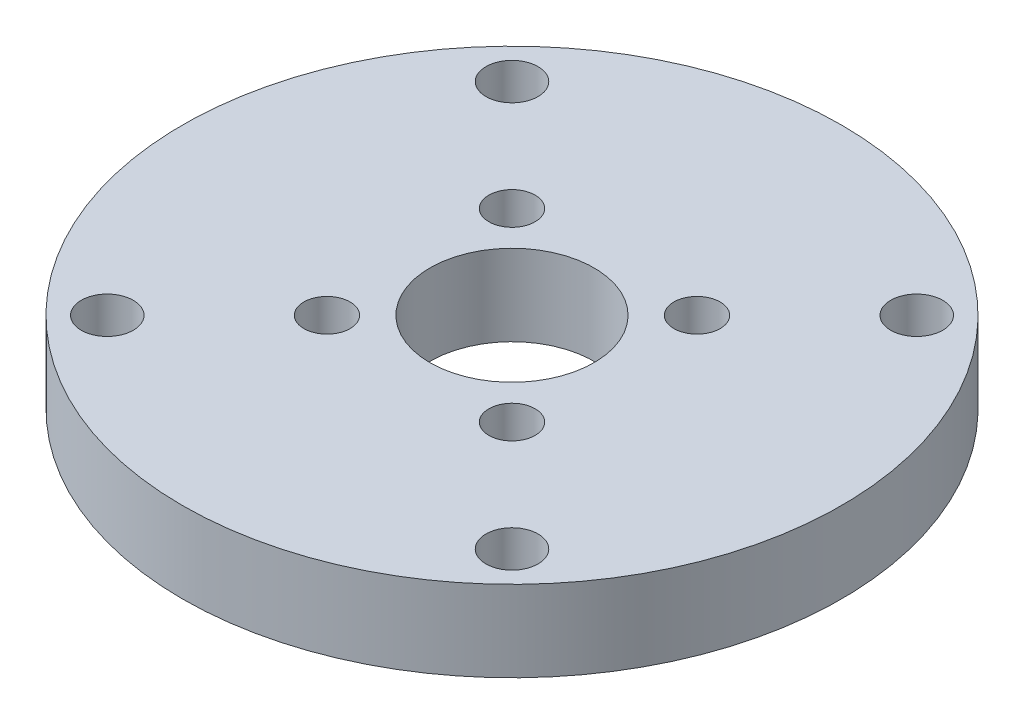
ISO-10303-21;
HEADER;
FILE_DESCRIPTION(('STEP AP214'),'2;1');
FILE_NAME('part.step','',(''),(''),'','','');
FILE_SCHEMA(('AUTOMOTIVE_DESIGN { 1 0 10303 214 1 1 1 1 }'));
ENDSEC;
DATA;
#1=APPLICATION_CONTEXT('core data for automotive mechanical design processes');
#2=APPLICATION_PROTOCOL_DEFINITION('international standard','automotive_design',2000,#1);
#3=PRODUCT_CONTEXT('',#1,'mechanical');
#4=PRODUCT('Part','Part','',(#3));
#5=PRODUCT_RELATED_PRODUCT_CATEGORY('part','',(#4));
#6=PRODUCT_DEFINITION_FORMATION('','',#4);
#7=PRODUCT_DEFINITION_CONTEXT('part definition',#1,'design');
#8=PRODUCT_DEFINITION('design','',#6,#7);
#9=PRODUCT_DEFINITION_SHAPE('','',#8);
#10=(LENGTH_UNIT() NAMED_UNIT(*) SI_UNIT(.MILLI.,.METRE.));
#11=(NAMED_UNIT(*) PLANE_ANGLE_UNIT() SI_UNIT($,.RADIAN.));
#12=(NAMED_UNIT(*) SI_UNIT($,.STERADIAN.) SOLID_ANGLE_UNIT());
#13=UNCERTAINTY_MEASURE_WITH_UNIT(LENGTH_MEASURE(1.E-05),#10,'distance_accuracy_value','');
#14=(GEOMETRIC_REPRESENTATION_CONTEXT(3) GLOBAL_UNCERTAINTY_ASSIGNED_CONTEXT((#13)) GLOBAL_UNIT_ASSIGNED_CONTEXT((#10,
#11,#12)) REPRESENTATION_CONTEXT('',''));
#15=CARTESIAN_POINT('',(0.,0.,0.));
#16=DIRECTION('',(0.,0.,1.));
#17=DIRECTION('',(1.,0.,0.));
#18=AXIS2_PLACEMENT_3D('',#15,#16,#17);
#19=CARTESIAN_POINT('',(0.,3.5,0.));
#20=DIRECTION('',(0.,-1.,0.));
#21=DIRECTION('',(0.,0.,-1.));
#22=AXIS2_PLACEMENT_3D('',#19,#20,#21);
#23=CYLINDRICAL_SURFACE('',#22,28.5);
#24=CARTESIAN_POINT('',(0.,3.5,0.));
#25=DIRECTION('',(0.,1.,0.));
#26=DIRECTION('',(0.,0.,1.));
#27=AXIS2_PLACEMENT_3D('',#24,#25,#26);
#28=CIRCLE('',#27,28.5);
#29=CARTESIAN_POINT('',(0.,3.5,28.5));
#30=VERTEX_POINT('',#29);
#31=EDGE_CURVE('E10',#30,#30,#28,.T.);
#32=ORIENTED_EDGE('',*,*,#31,.F.);
#33=EDGE_LOOP('',(#32));
#34=FACE_BOUND('',#33,.T.);
#35=CARTESIAN_POINT('',(0.,-3.5,0.));
#36=DIRECTION('',(0.,1.,0.));
#37=DIRECTION('',(0.,0.,1.));
#38=AXIS2_PLACEMENT_3D('',#35,#36,#37);
#39=CIRCLE('',#38,28.5);
#40=CARTESIAN_POINT('',(0.,-3.5,28.5));
#41=VERTEX_POINT('',#40);
#42=EDGE_CURVE('E40',#41,#41,#39,.T.);
#43=ORIENTED_EDGE('',*,*,#42,.T.);
#44=EDGE_LOOP('',(#43));
#45=FACE_BOUND('',#44,.T.);
#46=ADVANCED_FACE('F37',(#34,#45),#23,.T.);
#47=CARTESIAN_POINT('',(0.,3.5,0.));
#48=DIRECTION('',(0.,1.,0.));
#49=DIRECTION('',(0.,0.,1.));
#50=AXIS2_PLACEMENT_3D('',#47,#48,#49);
#51=PLANE('',#50);
#52=CARTESIAN_POINT('',(0.,3.5,0.));
#53=DIRECTION('',(0.,1.,0.));
#54=DIRECTION('',(0.,0.,1.));
#55=AXIS2_PLACEMENT_3D('',#52,#53,#54);
#56=CIRCLE('',#55,7.1);
#57=CARTESIAN_POINT('',(0.,3.5,7.1));
#58=VERTEX_POINT('',#57);
#59=EDGE_CURVE('E97',#58,#58,#56,.T.);
#60=ORIENTED_EDGE('',*,*,#59,.F.);
#61=EDGE_LOOP('',(#60));
#62=FACE_BOUND('',#61,.T.);
#63=CARTESIAN_POINT('',(17.5008928343671,3.5,17.500892834367));
#64=DIRECTION('',(0.,1.,0.));
#65=DIRECTION('',(0.,0.,1.));
#66=AXIS2_PLACEMENT_3D('',#63,#64,#65);
#67=CIRCLE('',#66,2.25);
#68=CARTESIAN_POINT('',(17.5008928343671,3.5,19.750892834367));
#69=VERTEX_POINT('',#68);
#70=EDGE_CURVE('E52',#69,#69,#67,.T.);
#71=ORIENTED_EDGE('',*,*,#70,.F.);
#72=EDGE_LOOP('',(#71));
#73=FACE_BOUND('',#72,.T.);
#74=CARTESIAN_POINT('',(-17.500892834367,3.5,17.5008928343671));
#75=DIRECTION('',(0.,1.,0.));
#76=DIRECTION('',(0.,0.,1.));
#77=AXIS2_PLACEMENT_3D('',#74,#75,#76);
#78=CIRCLE('',#77,2.25);
#79=CARTESIAN_POINT('',(-17.500892834367,3.5,19.7508928343671));
#80=VERTEX_POINT('',#79);
#81=EDGE_CURVE('E71',#80,#80,#78,.T.);
#82=ORIENTED_EDGE('',*,*,#81,.F.);
#83=EDGE_LOOP('',(#82));
#84=FACE_BOUND('',#83,.T.);
#85=CARTESIAN_POINT('',(-17.5008928343671,3.5,-17.500892834367));
#86=DIRECTION('',(0.,1.,0.));
#87=DIRECTION('',(0.,0.,1.));
#88=AXIS2_PLACEMENT_3D('',#85,#86,#87);
#89=CIRCLE('',#88,2.25);
#90=CARTESIAN_POINT('',(-17.5008928343671,3.5,-15.250892834367));
#91=VERTEX_POINT('',#90);
#92=EDGE_CURVE('E65',#91,#91,#89,.T.);
#93=ORIENTED_EDGE('',*,*,#92,.F.);
#94=EDGE_LOOP('',(#93));
#95=FACE_BOUND('',#94,.T.);
#96=CARTESIAN_POINT('',(-8.,3.5,8.));
#97=DIRECTION('',(0.,1.,0.));
#98=DIRECTION('',(0.,0.,1.));
#99=AXIS2_PLACEMENT_3D('',#96,#97,#98);
#100=CIRCLE('',#99,2.);
#101=CARTESIAN_POINT('',(-8.,3.5,10.));
#102=VERTEX_POINT('',#101);
#103=EDGE_CURVE('E58',#102,#102,#100,.T.);
#104=ORIENTED_EDGE('',*,*,#103,.F.);
#105=EDGE_LOOP('',(#104));
#106=FACE_BOUND('',#105,.T.);
#107=CARTESIAN_POINT('',(-8.,3.5,-8.));
#108=DIRECTION('',(0.,1.,0.));
#109=DIRECTION('',(0.,0.,1.));
#110=AXIS2_PLACEMENT_3D('',#107,#108,#109);
#111=CIRCLE('',#110,2.);
#112=CARTESIAN_POINT('',(-8.,3.5,-6.));
#113=VERTEX_POINT('',#112);
#114=EDGE_CURVE('E59',#113,#113,#111,.T.);
#115=ORIENTED_EDGE('',*,*,#114,.F.);
#116=EDGE_LOOP('',(#115));
#117=FACE_BOUND('',#116,.T.);
#118=CARTESIAN_POINT('',(8.,3.5,-8.));
#119=DIRECTION('',(0.,1.,0.));
#120=DIRECTION('',(0.,0.,1.));
#121=AXIS2_PLACEMENT_3D('',#118,#119,#120);
#122=CIRCLE('',#121,2.);
#123=CARTESIAN_POINT('',(8.,3.5,-6.));
#124=VERTEX_POINT('',#123);
#125=EDGE_CURVE('E89',#124,#124,#122,.T.);
#126=ORIENTED_EDGE('',*,*,#125,.F.);
#127=EDGE_LOOP('',(#126));
#128=FACE_BOUND('',#127,.T.);
#129=CARTESIAN_POINT('',(8.,3.5,8.));
#130=DIRECTION('',(0.,1.,0.));
#131=DIRECTION('',(0.,0.,1.));
#132=AXIS2_PLACEMENT_3D('',#129,#130,#131);
#133=CIRCLE('',#132,2.);
#134=CARTESIAN_POINT('',(8.,3.5,10.));
#135=VERTEX_POINT('',#134);
#136=EDGE_CURVE('E82',#135,#135,#133,.T.);
#137=ORIENTED_EDGE('',*,*,#136,.F.);
#138=EDGE_LOOP('',(#137));
#139=FACE_BOUND('',#138,.T.);
#140=CARTESIAN_POINT('',(17.500892834367,3.5,-17.5008928343671));
#141=DIRECTION('',(0.,1.,0.));
#142=DIRECTION('',(0.,0.,1.));
#143=AXIS2_PLACEMENT_3D('',#140,#141,#142);
#144=CIRCLE('',#143,2.25);
#145=CARTESIAN_POINT('',(17.500892834367,3.5,-15.2508928343671));
#146=VERTEX_POINT('',#145);
#147=EDGE_CURVE('E49',#146,#146,#144,.T.);
#148=ORIENTED_EDGE('',*,*,#147,.F.);
#149=EDGE_LOOP('',(#148));
#150=FACE_BOUND('',#149,.T.);
#151=ORIENTED_EDGE('',*,*,#31,.T.);
#152=EDGE_LOOP('',(#151));
#153=FACE_BOUND('',#152,.T.);
#154=ADVANCED_FACE('F113',(#62,#73,#84,#95,#106,#117,#128,#139,#150,#153),#51,.T.);
#155=CARTESIAN_POINT('',(0.,-3.5,0.));
#156=DIRECTION('',(0.,1.,0.));
#157=DIRECTION('',(0.,0.,1.));
#158=AXIS2_PLACEMENT_3D('',#155,#156,#157);
#159=PLANE('',#158);
#160=CARTESIAN_POINT('',(0.,-3.5,0.));
#161=DIRECTION('',(0.,1.,0.));
#162=DIRECTION('',(0.,0.,1.));
#163=AXIS2_PLACEMENT_3D('',#160,#161,#162);
#164=CIRCLE('',#163,7.1);
#165=CARTESIAN_POINT('',(0.,-3.5,7.1));
#166=VERTEX_POINT('',#165);
#167=EDGE_CURVE('E83',#166,#166,#164,.T.);
#168=ORIENTED_EDGE('',*,*,#167,.T.);
#169=EDGE_LOOP('',(#168));
#170=FACE_BOUND('',#169,.T.);
#171=CARTESIAN_POINT('',(17.5008928343671,-3.5,17.500892834367));
#172=DIRECTION('',(0.,1.,0.));
#173=DIRECTION('',(0.,0.,1.));
#174=AXIS2_PLACEMENT_3D('',#171,#172,#173);
#175=CIRCLE('',#174,2.25);
#176=CARTESIAN_POINT('',(17.5008928343671,-3.5,19.750892834367));
#177=VERTEX_POINT('',#176);
#178=EDGE_CURVE('E74',#177,#177,#175,.T.);
#179=ORIENTED_EDGE('',*,*,#178,.T.);
#180=EDGE_LOOP('',(#179));
#181=FACE_BOUND('',#180,.T.);
#182=CARTESIAN_POINT('',(-17.500892834367,-3.5,17.5008928343671));
#183=DIRECTION('',(0.,1.,0.));
#184=DIRECTION('',(0.,0.,1.));
#185=AXIS2_PLACEMENT_3D('',#182,#183,#184);
#186=CIRCLE('',#185,2.25);
#187=CARTESIAN_POINT('',(-17.500892834367,-3.5,19.7508928343671));
#188=VERTEX_POINT('',#187);
#189=EDGE_CURVE('E68',#188,#188,#186,.T.);
#190=ORIENTED_EDGE('',*,*,#189,.T.);
#191=EDGE_LOOP('',(#190));
#192=FACE_BOUND('',#191,.T.);
#193=CARTESIAN_POINT('',(-17.5008928343671,-3.5,-17.500892834367));
#194=DIRECTION('',(0.,1.,0.));
#195=DIRECTION('',(0.,0.,1.));
#196=AXIS2_PLACEMENT_3D('',#193,#194,#195);
#197=CIRCLE('',#196,2.25);
#198=CARTESIAN_POINT('',(-17.5008928343671,-3.5,-15.250892834367));
#199=VERTEX_POINT('',#198);
#200=EDGE_CURVE('E62',#199,#199,#197,.T.);
#201=ORIENTED_EDGE('',*,*,#200,.T.);
#202=EDGE_LOOP('',(#201));
#203=FACE_BOUND('',#202,.T.);
#204=CARTESIAN_POINT('',(-8.,-3.5,8.));
#205=DIRECTION('',(0.,1.,0.));
#206=DIRECTION('',(0.,0.,1.));
#207=AXIS2_PLACEMENT_3D('',#204,#205,#206);
#208=CIRCLE('',#207,2.);
#209=CARTESIAN_POINT('',(-8.,-3.5,10.));
#210=VERTEX_POINT('',#209);
#211=EDGE_CURVE('E55',#210,#210,#208,.T.);
#212=ORIENTED_EDGE('',*,*,#211,.T.);
#213=EDGE_LOOP('',(#212));
#214=FACE_BOUND('',#213,.T.);
#215=CARTESIAN_POINT('',(-8.,-3.5,-8.));
#216=DIRECTION('',(0.,1.,0.));
#217=DIRECTION('',(0.,0.,1.));
#218=AXIS2_PLACEMENT_3D('',#215,#216,#217);
#219=CIRCLE('',#218,2.);
#220=CARTESIAN_POINT('',(-8.,-3.5,-6.));
#221=VERTEX_POINT('',#220);
#222=EDGE_CURVE('E92',#221,#221,#219,.T.);
#223=ORIENTED_EDGE('',*,*,#222,.T.);
#224=EDGE_LOOP('',(#223));
#225=FACE_BOUND('',#224,.T.);
#226=CARTESIAN_POINT('',(8.,-3.5,-8.));
#227=DIRECTION('',(0.,1.,0.));
#228=DIRECTION('',(0.,0.,1.));
#229=AXIS2_PLACEMENT_3D('',#226,#227,#228);
#230=CIRCLE('',#229,2.);
#231=CARTESIAN_POINT('',(8.,-3.5,-6.));
#232=VERTEX_POINT('',#231);
#233=EDGE_CURVE('E86',#232,#232,#230,.T.);
#234=ORIENTED_EDGE('',*,*,#233,.T.);
#235=EDGE_LOOP('',(#234));
#236=FACE_BOUND('',#235,.T.);
#237=CARTESIAN_POINT('',(8.,-3.5,8.));
#238=DIRECTION('',(0.,1.,0.));
#239=DIRECTION('',(0.,0.,1.));
#240=AXIS2_PLACEMENT_3D('',#237,#238,#239);
#241=CIRCLE('',#240,2.);
#242=CARTESIAN_POINT('',(8.,-3.5,10.));
#243=VERTEX_POINT('',#242);
#244=EDGE_CURVE('E79',#243,#243,#241,.T.);
#245=ORIENTED_EDGE('',*,*,#244,.T.);
#246=EDGE_LOOP('',(#245));
#247=FACE_BOUND('',#246,.T.);
#248=CARTESIAN_POINT('',(17.500892834367,-3.5,-17.5008928343671));
#249=DIRECTION('',(0.,1.,0.));
#250=DIRECTION('',(0.,0.,1.));
#251=AXIS2_PLACEMENT_3D('',#248,#249,#250);
#252=CIRCLE('',#251,2.25);
#253=CARTESIAN_POINT('',(17.500892834367,-3.5,-15.2508928343671));
#254=VERTEX_POINT('',#253);
#255=EDGE_CURVE('E47',#254,#254,#252,.T.);
#256=ORIENTED_EDGE('',*,*,#255,.T.);
#257=EDGE_LOOP('',(#256));
#258=FACE_BOUND('',#257,.T.);
#259=ORIENTED_EDGE('',*,*,#42,.F.);
#260=EDGE_LOOP('',(#259));
#261=FACE_BOUND('',#260,.T.);
#262=ADVANCED_FACE('F103',(#170,#181,#192,#203,#214,#225,#236,#247,#258,#261),#159,.F.);
#263=CARTESIAN_POINT('',(17.500892834367,-3.5,-17.5008928343671));
#264=DIRECTION('',(0.,1.,0.));
#265=DIRECTION('',(0.,0.,1.));
#266=AXIS2_PLACEMENT_3D('',#263,#264,#265);
#267=CYLINDRICAL_SURFACE('',#266,2.25);
#268=ORIENTED_EDGE('',*,*,#255,.F.);
#269=EDGE_LOOP('',(#268));
#270=FACE_BOUND('',#269,.T.);
#271=ORIENTED_EDGE('',*,*,#147,.T.);
#272=EDGE_LOOP('',(#271));
#273=FACE_BOUND('',#272,.T.);
#274=ADVANCED_FACE('F133',(#270,#273),#267,.F.);
#275=CARTESIAN_POINT('',(8.,-3.5,8.));
#276=DIRECTION('',(0.,1.,0.));
#277=DIRECTION('',(0.,0.,1.));
#278=AXIS2_PLACEMENT_3D('',#275,#276,#277);
#279=CYLINDRICAL_SURFACE('',#278,2.);
#280=ORIENTED_EDGE('',*,*,#244,.F.);
#281=EDGE_LOOP('',(#280));
#282=FACE_BOUND('',#281,.T.);
#283=ORIENTED_EDGE('',*,*,#136,.T.);
#284=EDGE_LOOP('',(#283));
#285=FACE_BOUND('',#284,.T.);
#286=ADVANCED_FACE('F135',(#282,#285),#279,.F.);
#287=CARTESIAN_POINT('',(8.,-3.5,-8.));
#288=DIRECTION('',(0.,1.,0.));
#289=DIRECTION('',(0.,0.,1.));
#290=AXIS2_PLACEMENT_3D('',#287,#288,#289);
#291=CYLINDRICAL_SURFACE('',#290,2.);
#292=ORIENTED_EDGE('',*,*,#233,.F.);
#293=EDGE_LOOP('',(#292));
#294=FACE_BOUND('',#293,.T.);
#295=ORIENTED_EDGE('',*,*,#125,.T.);
#296=EDGE_LOOP('',(#295));
#297=FACE_BOUND('',#296,.T.);
#298=ADVANCED_FACE('F142',(#294,#297),#291,.F.);
#299=CARTESIAN_POINT('',(-8.,-3.5,-8.));
#300=DIRECTION('',(0.,1.,0.));
#301=DIRECTION('',(0.,0.,1.));
#302=AXIS2_PLACEMENT_3D('',#299,#300,#301);
#303=CYLINDRICAL_SURFACE('',#302,2.);
#304=ORIENTED_EDGE('',*,*,#222,.F.);
#305=EDGE_LOOP('',(#304));
#306=FACE_BOUND('',#305,.T.);
#307=ORIENTED_EDGE('',*,*,#114,.T.);
#308=EDGE_LOOP('',(#307));
#309=FACE_BOUND('',#308,.T.);
#310=ADVANCED_FACE('F187',(#306,#309),#303,.F.);
#311=CARTESIAN_POINT('',(-8.,-3.5,8.));
#312=DIRECTION('',(0.,1.,0.));
#313=DIRECTION('',(0.,0.,1.));
#314=AXIS2_PLACEMENT_3D('',#311,#312,#313);
#315=CYLINDRICAL_SURFACE('',#314,2.);
#316=ORIENTED_EDGE('',*,*,#211,.F.);
#317=EDGE_LOOP('',(#316));
#318=FACE_BOUND('',#317,.T.);
#319=ORIENTED_EDGE('',*,*,#103,.T.);
#320=EDGE_LOOP('',(#319));
#321=FACE_BOUND('',#320,.T.);
#322=ADVANCED_FACE('F197',(#318,#321),#315,.F.);
#323=CARTESIAN_POINT('',(-17.5008928343671,-3.5,-17.500892834367));
#324=DIRECTION('',(0.,1.,0.));
#325=DIRECTION('',(0.,0.,1.));
#326=AXIS2_PLACEMENT_3D('',#323,#324,#325);
#327=CYLINDRICAL_SURFACE('',#326,2.25);
#328=ORIENTED_EDGE('',*,*,#200,.F.);
#329=EDGE_LOOP('',(#328));
#330=FACE_BOUND('',#329,.T.);
#331=ORIENTED_EDGE('',*,*,#92,.T.);
#332=EDGE_LOOP('',(#331));
#333=FACE_BOUND('',#332,.T.);
#334=ADVANCED_FACE('F207',(#330,#333),#327,.F.);
#335=CARTESIAN_POINT('',(-17.500892834367,-3.5,17.5008928343671));
#336=DIRECTION('',(0.,1.,0.));
#337=DIRECTION('',(0.,0.,1.));
#338=AXIS2_PLACEMENT_3D('',#335,#336,#337);
#339=CYLINDRICAL_SURFACE('',#338,2.25);
#340=ORIENTED_EDGE('',*,*,#189,.F.);
#341=EDGE_LOOP('',(#340));
#342=FACE_BOUND('',#341,.T.);
#343=ORIENTED_EDGE('',*,*,#81,.T.);
#344=EDGE_LOOP('',(#343));
#345=FACE_BOUND('',#344,.T.);
#346=ADVANCED_FACE('F216',(#342,#345),#339,.F.);
#347=CARTESIAN_POINT('',(17.5008928343671,-3.5,17.500892834367));
#348=DIRECTION('',(0.,1.,0.));
#349=DIRECTION('',(0.,0.,1.));
#350=AXIS2_PLACEMENT_3D('',#347,#348,#349);
#351=CYLINDRICAL_SURFACE('',#350,2.25);
#352=ORIENTED_EDGE('',*,*,#178,.F.);
#353=EDGE_LOOP('',(#352));
#354=FACE_BOUND('',#353,.T.);
#355=ORIENTED_EDGE('',*,*,#70,.T.);
#356=EDGE_LOOP('',(#355));
#357=FACE_BOUND('',#356,.T.);
#358=ADVANCED_FACE('F109',(#354,#357),#351,.F.);
#359=CARTESIAN_POINT('',(0.,-3.5,0.));
#360=DIRECTION('',(0.,1.,0.));
#361=DIRECTION('',(0.,0.,1.));
#362=AXIS2_PLACEMENT_3D('',#359,#360,#361);
#363=CYLINDRICAL_SURFACE('',#362,7.1);
#364=ORIENTED_EDGE('',*,*,#167,.F.);
#365=EDGE_LOOP('',(#364));
#366=FACE_BOUND('',#365,.T.);
#367=ORIENTED_EDGE('',*,*,#59,.T.);
#368=EDGE_LOOP('',(#367));
#369=FACE_BOUND('',#368,.T.);
#370=ADVANCED_FACE('F106',(#366,#369),#363,.F.);
#371=CLOSED_SHELL('',(#46,#154,#262,#274,#286,#298,#310,#322,#334,#346,#358,#370));
#372=MANIFOLD_SOLID_BREP('B2',#371);
#373=ADVANCED_BREP_SHAPE_REPRESENTATION('',(#18,#372),#14);
#374=SHAPE_DEFINITION_REPRESENTATION(#9,#373);
ENDSEC;
END-ISO-10303-21;
